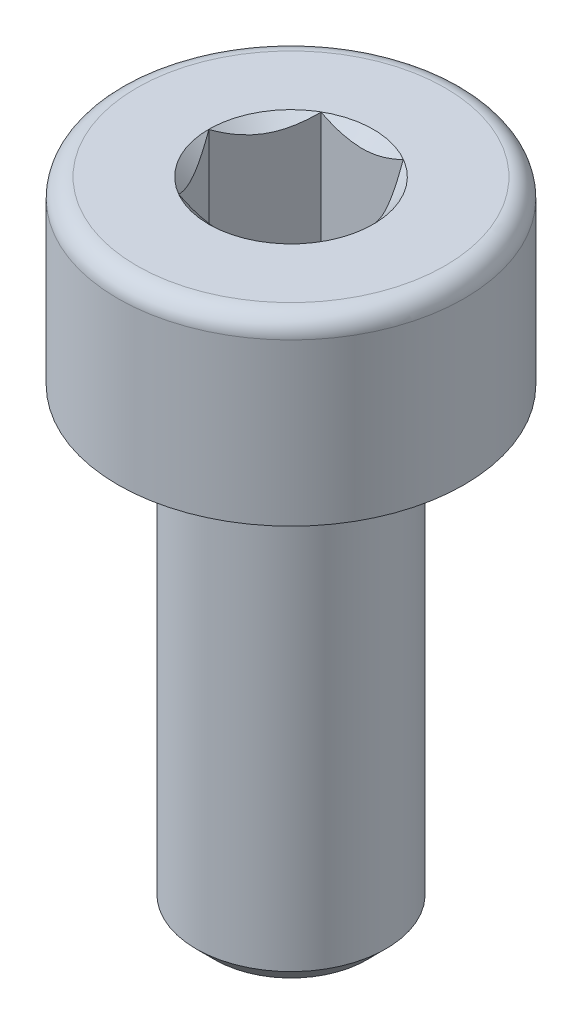
ISO-10303-21;
HEADER;
FILE_DESCRIPTION(('STEP AP214'),'2;1');
FILE_NAME('part.step','',(''),(''),'','','');
FILE_SCHEMA(('AUTOMOTIVE_DESIGN { 1 0 10303 214 1 1 1 1 }'));
ENDSEC;
DATA;
#1=APPLICATION_CONTEXT('core data for automotive mechanical design processes');
#2=APPLICATION_PROTOCOL_DEFINITION('international standard','automotive_design',2000,#1);
#3=PRODUCT_CONTEXT('',#1,'mechanical');
#4=PRODUCT('Part','Part','',(#3));
#5=PRODUCT_RELATED_PRODUCT_CATEGORY('part','',(#4));
#6=PRODUCT_DEFINITION_FORMATION('','',#4);
#7=PRODUCT_DEFINITION_CONTEXT('part definition',#1,'design');
#8=PRODUCT_DEFINITION('design','',#6,#7);
#9=PRODUCT_DEFINITION_SHAPE('','',#8);
#10=(LENGTH_UNIT() NAMED_UNIT(*) SI_UNIT(.MILLI.,.METRE.));
#11=(NAMED_UNIT(*) PLANE_ANGLE_UNIT() SI_UNIT($,.RADIAN.));
#12=(NAMED_UNIT(*) SI_UNIT($,.STERADIAN.) SOLID_ANGLE_UNIT());
#13=UNCERTAINTY_MEASURE_WITH_UNIT(LENGTH_MEASURE(1.E-05),#10,'distance_accuracy_value','');
#14=(GEOMETRIC_REPRESENTATION_CONTEXT(3) GLOBAL_UNCERTAINTY_ASSIGNED_CONTEXT((#13)) GLOBAL_UNIT_ASSIGNED_CONTEXT((#10,
#11,#12)) REPRESENTATION_CONTEXT('',''));
#15=CARTESIAN_POINT('',(0.,0.,0.));
#16=DIRECTION('',(0.,0.,1.));
#17=DIRECTION('',(1.,0.,0.));
#18=AXIS2_PLACEMENT_3D('',#15,#16,#17);
#19=CARTESIAN_POINT('',(0.,1.9,0.));
#20=DIRECTION('',(0.,1.,0.));
#21=DIRECTION('',(0.,0.,1.));
#22=AXIS2_PLACEMENT_3D('',#19,#20,#21);
#23=CONICAL_SURFACE('',#22,0.8675,0.785398163397447);
#24=CARTESIAN_POINT('',(-0.904257203356344,2.20731108686539,0.75));
#25=CARTESIAN_POINT('',(-0.882412754882664,2.19049979910954,0.75));
#26=CARTESIAN_POINT('',(-0.860451107500837,2.17384125033269,0.75));
#27=CARTESIAN_POINT('',(-0.816244486084032,2.14089387022514,0.75));
#28=CARTESIAN_POINT('',(-0.793999446840781,2.12460512647585,0.75));
#29=CARTESIAN_POINT('',(-0.72644041609512,2.07615733343807,0.75));
#30=CARTESIAN_POINT('',(-0.680633506413183,2.04467463278481,0.75));
#31=CARTESIAN_POINT('',(-0.584305204334507,1.98248336485275,0.75));
#32=CARTESIAN_POINT('',(-0.533669074640383,1.95195058649996,0.75));
#33=CARTESIAN_POINT('',(-0.42982179281195,1.89583225025063,0.75));
#34=CARTESIAN_POINT('',(-0.376620129723797,1.87022998377489,0.75));
#35=CARTESIAN_POINT('',(-0.297133733137049,1.83889962113901,0.75));
#36=CARTESIAN_POINT('',(-0.272118020151624,1.82998013178715,0.75));
#37=CARTESIAN_POINT('',(-0.221461613995012,1.81414014673559,0.75));
#38=CARTESIAN_POINT('',(-0.195820881172346,1.80721977822058,0.75));
#39=CARTESIAN_POINT('',(-0.11907719555794,1.79029491353452,0.75));
#40=CARTESIAN_POINT('',(-0.0671369524161806,1.78369713453022,0.75));
#41=CARTESIAN_POINT('',(0.0346954769499289,1.78165186600552,0.75));
#42=CARTESIAN_POINT('',(0.0845776810804192,1.78572847067954,0.75));
#43=CARTESIAN_POINT('',(0.158553806983135,1.79867277619897,0.75));
#44=CARTESIAN_POINT('',(0.183299969448746,1.80421127142444,0.75));
#45=CARTESIAN_POINT('',(0.2322573109883,1.81728731594566,0.75));
#46=CARTESIAN_POINT('',(0.256468520143736,1.82482475252543,0.75));
#47=CARTESIAN_POINT('',(0.330945548164446,1.85089644122846,0.75));
#48=CARTESIAN_POINT('',(0.380191097628158,1.87232740617748,0.75));
#49=CARTESIAN_POINT('',(0.476384677382066,1.92001795957995,0.75));
#50=CARTESIAN_POINT('',(0.523323854348435,1.94629455464135,0.75));
#51=CARTESIAN_POINT('',(0.613051165606589,2.0005514563587,0.75));
#52=CARTESIAN_POINT('',(0.655929862931857,2.02838392150654,0.75));
#53=CARTESIAN_POINT('',(0.719102713352825,2.07143006191857,0.75));
#54=CARTESIAN_POINT('',(0.739888629425195,2.08593448465665,0.75));
#55=CARTESIAN_POINT('',(0.781175323237966,2.11533224663196,0.75));
#56=CARTESIAN_POINT('',(0.801676177588827,2.13022547815469,0.75));
#57=CARTESIAN_POINT('',(0.822058112601666,2.14528009529925,0.75));
#58=B_SPLINE_CURVE_WITH_KNOTS('',3,(#24,#25,#26,#27,#28,#29,#30,#31,#32,#33,#34,#35,#36,#37,#38,
#39,#40,#41,#42,#43,#44,#45,#46,#47,#48,#49,#50,#51,#52,#53,#54,#55,#56,#57),.UNSPECIFIED.,.F.,
.F.,(4,2,2,2,2,2,2,2,2,2,2,2,2,2,2,2,4),(0.,0.0826914229952001,0.165402229814626,
0.332081999269816,0.509334939536265,0.685976204286451,0.765577633128521,0.845184125124187,
1.00113218157557,1.15024704962126,1.22624853107426,1.30224572787936,1.46290132447987,
1.62413188955185,1.7774144062988,1.85345016985303,1.92946508764176),.UNSPECIFIED.);
#59=CARTESIAN_POINT('',(0.433012701892219,1.89852540378444,0.75));
#60=VERTEX_POINT('',#59);
#61=CARTESIAN_POINT('',(-0.433012701892219,1.89852540378444,0.75));
#62=VERTEX_POINT('',#61);
#63=EDGE_CURVE('E102',#60,#62,#58,.F.);
#64=ORIENTED_EDGE('',*,*,#63,.T.);
#65=CARTESIAN_POINT('',(-0.432897231838381,1.89864089692921,0.7502));
#66=CARTESIAN_POINT('',(-0.447787073663449,1.88375951424836,0.724410037442318));
#67=CARTESIAN_POINT('',(-0.462925913388238,1.86975166939139,0.698188797871341));
#68=CARTESIAN_POINT('',(-0.493795969782309,1.8441029284667,0.644720291764294));
#69=CARTESIAN_POINT('',(-0.509530126716838,1.8324763154901,0.617467932539428));
#70=CARTESIAN_POINT('',(-0.541257419404004,1.81255944955668,0.562514649618647));
#71=CARTESIAN_POINT('',(-0.55724246221751,1.80421909786581,0.534827743304491));
#72=CARTESIAN_POINT('',(-0.589564457733289,1.79136814574586,0.478844404869148));
#73=CARTESIAN_POINT('',(-0.605900421776115,1.78684794437327,0.450549685156356));
#74=CARTESIAN_POINT('',(-0.634052006136182,1.78277123688187,0.401789710731158));
#75=CARTESIAN_POINT('',(-0.645830977225007,1.78216820039852,0.381387934344429));
#76=CARTESIAN_POINT('',(-0.66936612345897,1.78317990979996,0.340623865303642));
#77=CARTESIAN_POINT('',(-0.681122293004409,1.78479514477447,0.320261582348547));
#78=CARTESIAN_POINT('',(-0.716222952390205,1.79286155075748,0.259465456913179));
#79=CARTESIAN_POINT('',(-0.739392776123958,1.80253433961216,0.219334145003904));
#80=CARTESIAN_POINT('',(-0.780063953349298,1.82588172175675,0.148889599645977));
#81=CARTESIAN_POINT('',(-0.797755796753171,1.83833396185669,0.118246427990916));
#82=CARTESIAN_POINT('',(-0.832446334428589,1.8663850140153,0.058160654195211));
#83=CARTESIAN_POINT('',(-0.849447072771901,1.88197358968819,0.0287145116184094));
#84=CARTESIAN_POINT('',(-0.866140873838277,1.89864089692921,-0.00020000000000046));
#85=B_SPLINE_CURVE_WITH_KNOTS('',3,(#65,#66,#67,#68,#69,#70,#71,#72,#73,#74,#75,#76,#77,#78,#79,
#80,#81,#82,#83,#84),.UNSPECIFIED.,.F.,.F.,(4,2,2,2,2,2,2,2,2,4),(0.,0.0999419466095594,
0.200466857654445,0.299393763705716,0.398071297300229,0.468665775681746,0.539275821398836,
0.680536257244562,0.792918418368072,0.904939568716033),.UNSPECIFIED.);
#86=CARTESIAN_POINT('',(-0.866025403784439,1.89852540378444,0.));
#87=VERTEX_POINT('',#86);
#88=EDGE_CURVE('E11',#62,#87,#85,.T.);
#89=ORIENTED_EDGE('',*,*,#88,.T.);
#90=CARTESIAN_POINT('',(-0.866140873838277,1.89864089692921,0.000199999999999512));
#91=CARTESIAN_POINT('',(-0.851251032013209,1.88375951424836,-0.0255899625576818));
#92=CARTESIAN_POINT('',(-0.836112192288419,1.8697516693914,-0.0518112021286593));
#93=CARTESIAN_POINT('',(-0.805242135894349,1.8441029284667,-0.105279708235706));
#94=CARTESIAN_POINT('',(-0.78950797895982,1.8324763154901,-0.132532067460572));
#95=CARTESIAN_POINT('',(-0.757780686272654,1.81255944955668,-0.187485350381352));
#96=CARTESIAN_POINT('',(-0.741795643459148,1.80421909786581,-0.215172256695509));
#97=CARTESIAN_POINT('',(-0.709473647943368,1.79136814574586,-0.271155595130852));
#98=CARTESIAN_POINT('',(-0.693137683900543,1.78684794437327,-0.299450314843644));
#99=CARTESIAN_POINT('',(-0.664986099540476,1.78277123688187,-0.348210289268842));
#100=CARTESIAN_POINT('',(-0.653207128451651,1.78216820039852,-0.368612065655571));
#101=CARTESIAN_POINT('',(-0.629671982217688,1.78317990979996,-0.409376134696358));
#102=CARTESIAN_POINT('',(-0.617915812672249,1.78479514477447,-0.429738417651453));
#103=CARTESIAN_POINT('',(-0.582815153286453,1.79286155075748,-0.490534543086821));
#104=CARTESIAN_POINT('',(-0.5596453295527,1.80253433961216,-0.530665854996096));
#105=CARTESIAN_POINT('',(-0.51897415232736,1.82588172175675,-0.601110400354023));
#106=CARTESIAN_POINT('',(-0.501282308923487,1.83833396185669,-0.631753572009084));
#107=CARTESIAN_POINT('',(-0.466591771248069,1.8663850140153,-0.691839345804789));
#108=CARTESIAN_POINT('',(-0.449591032904757,1.88197358968819,-0.72128548838159));
#109=CARTESIAN_POINT('',(-0.432897231838381,1.89864089692921,-0.7502));
#110=B_SPLINE_CURVE_WITH_KNOTS('',3,(#90,#91,#92,#93,#94,#95,#96,#97,#98,#99,#100,#101,#102,
#103,#104,#105,#106,#107,#108,#109),.UNSPECIFIED.,.F.,.F.,(4,2,2,2,2,2,2,2,2,4),(0.,
0.0999419466095592,0.200466857654445,0.299393763705716,0.398071297300228,0.468665775681745,
0.539275821398836,0.680536257244562,0.792918418368072,0.904939568716032),.UNSPECIFIED.);
#111=CARTESIAN_POINT('',(-0.433012701892219,1.89852540378444,-0.75));
#112=VERTEX_POINT('',#111);
#113=EDGE_CURVE('E47',#87,#112,#110,.T.);
#114=ORIENTED_EDGE('',*,*,#113,.T.);
#115=CARTESIAN_POINT('',(-0.904257203356344,2.20731108686539,-0.75));
#116=CARTESIAN_POINT('',(-0.882412754882664,2.19049979910954,-0.75));
#117=CARTESIAN_POINT('',(-0.860451107500837,2.17384125033269,-0.75));
#118=CARTESIAN_POINT('',(-0.816244486084032,2.14089387022514,-0.75));
#119=CARTESIAN_POINT('',(-0.793999446840781,2.12460512647585,-0.75));
#120=CARTESIAN_POINT('',(-0.72644041609512,2.07615733343807,-0.75));
#121=CARTESIAN_POINT('',(-0.680633506413183,2.04467463278481,-0.75));
#122=CARTESIAN_POINT('',(-0.584305204334507,1.98248336485275,-0.75));
#123=CARTESIAN_POINT('',(-0.533669074640383,1.95195058649996,-0.75));
#124=CARTESIAN_POINT('',(-0.42982179281195,1.89583225025063,-0.75));
#125=CARTESIAN_POINT('',(-0.376620129723797,1.87022998377489,-0.75));
#126=CARTESIAN_POINT('',(-0.297133733137048,1.83889962113901,-0.75));
#127=CARTESIAN_POINT('',(-0.272118020151624,1.82998013178715,-0.75));
#128=CARTESIAN_POINT('',(-0.221461613995012,1.81414014673559,-0.75));
#129=CARTESIAN_POINT('',(-0.195820881172346,1.80721977822059,-0.75));
#130=CARTESIAN_POINT('',(-0.11907719555794,1.79029491353453,-0.75));
#131=CARTESIAN_POINT('',(-0.0671369524161802,1.78369713453023,-0.75));
#132=CARTESIAN_POINT('',(0.0346954769499295,1.78165186600552,-0.75));
#133=CARTESIAN_POINT('',(0.0845776810804198,1.78572847067954,-0.75));
#134=CARTESIAN_POINT('',(0.158553806983135,1.79867277619897,-0.75));
#135=CARTESIAN_POINT('',(0.183299969448746,1.80421127142444,-0.75));
#136=CARTESIAN_POINT('',(0.2322573109883,1.81728731594566,-0.75));
#137=CARTESIAN_POINT('',(0.256468520143736,1.82482475252543,-0.75));
#138=CARTESIAN_POINT('',(0.330945548164446,1.85089644122846,-0.75));
#139=CARTESIAN_POINT('',(0.380191097628158,1.87232740617748,-0.75));
#140=CARTESIAN_POINT('',(0.476384677382067,1.92001795957995,-0.75));
#141=CARTESIAN_POINT('',(0.523323854348436,1.94629455464135,-0.75));
#142=CARTESIAN_POINT('',(0.61305116560659,2.0005514563587,-0.75));
#143=CARTESIAN_POINT('',(0.655929862931858,2.02838392150654,-0.75));
#144=CARTESIAN_POINT('',(0.719102713352826,2.07143006191857,-0.75));
#145=CARTESIAN_POINT('',(0.739888629425196,2.08593448465665,-0.75));
#146=CARTESIAN_POINT('',(0.781175323237966,2.11533224663196,-0.75));
#147=CARTESIAN_POINT('',(0.801676177588828,2.13022547815469,-0.75));
#148=CARTESIAN_POINT('',(0.822058112601667,2.14528009529925,-0.75));
#149=B_SPLINE_CURVE_WITH_KNOTS('',3,(#115,#116,#117,#118,#119,#120,#121,#122,#123,#124,#125,
#126,#127,#128,#129,#130,#131,#132,#133,#134,#135,#136,#137,#138,#139,#140,#141,#142,#143,#144,
#145,#146,#147,#148),.UNSPECIFIED.,.F.,.F.,(4,2,2,2,2,2,2,2,2,2,2,2,2,2,2,2,4),(0.,
0.0826914229952003,0.165402229814626,0.332081999269817,0.509334939536265,0.685976204286452,
0.765577633128521,0.845184125124188,1.00113218157557,1.15024704962126,1.22624853107426,
1.30224572787936,1.46290132447987,1.62413188955185,1.7774144062988,1.85345016985303,
1.92946508764176),.UNSPECIFIED.);
#150=CARTESIAN_POINT('',(0.433012701892219,1.89852540378444,-0.75));
#151=VERTEX_POINT('',#150);
#152=EDGE_CURVE('E226',#112,#151,#149,.T.);
#153=ORIENTED_EDGE('',*,*,#152,.T.);
#154=CARTESIAN_POINT('',(0.432897231838381,1.89864089692921,-0.7502));
#155=CARTESIAN_POINT('',(0.447787073663449,1.88375951424836,-0.724410037442319));
#156=CARTESIAN_POINT('',(0.462925913388238,1.8697516693914,-0.698188797871341));
#157=CARTESIAN_POINT('',(0.493795969782309,1.8441029284667,-0.644720291764295));
#158=CARTESIAN_POINT('',(0.509530126716838,1.8324763154901,-0.617467932539429));
#159=CARTESIAN_POINT('',(0.541257419404004,1.81255944955668,-0.562514649618648));
#160=CARTESIAN_POINT('',(0.55724246221751,1.80421909786581,-0.534827743304492));
#161=CARTESIAN_POINT('',(0.589564457733289,1.79136814574586,-0.478844404869149));
#162=CARTESIAN_POINT('',(0.605900421776115,1.78684794437327,-0.450549685156357));
#163=CARTESIAN_POINT('',(0.634052006136182,1.78277123688187,-0.401789710731159));
#164=CARTESIAN_POINT('',(0.645830977225007,1.78216820039852,-0.38138793434443));
#165=CARTESIAN_POINT('',(0.66936612345897,1.78317990979996,-0.340623865303643));
#166=CARTESIAN_POINT('',(0.681122293004409,1.78479514477447,-0.320261582348548));
#167=CARTESIAN_POINT('',(0.716222952390205,1.79286155075748,-0.25946545691318));
#168=CARTESIAN_POINT('',(0.739392776123958,1.80253433961216,-0.219334145003905));
#169=CARTESIAN_POINT('',(0.780063953349298,1.82588172175675,-0.148889599645978));
#170=CARTESIAN_POINT('',(0.797755796753172,1.83833396185669,-0.118246427990917));
#171=CARTESIAN_POINT('',(0.832446334428589,1.8663850140153,-0.058160654195212));
#172=CARTESIAN_POINT('',(0.849447072771901,1.88197358968819,-0.0287145116184103));
#173=CARTESIAN_POINT('',(0.866140873838277,1.89864089692921,0.000199999999999458));
#174=B_SPLINE_CURVE_WITH_KNOTS('',3,(#154,#155,#156,#157,#158,#159,#160,#161,#162,#163,#164,
#165,#166,#167,#168,#169,#170,#171,#172,#173),.UNSPECIFIED.,.F.,.F.,(4,2,2,2,2,2,2,2,2,4),(0.,
0.0999419466095591,0.200466857654445,0.299393763705716,0.398071297300228,0.468665775681745,
0.539275821398836,0.680536257244562,0.792918418368072,0.904939568716032),.UNSPECIFIED.);
#175=CARTESIAN_POINT('',(0.866025403784439,1.89852540378444,0.));
#176=VERTEX_POINT('',#175);
#177=EDGE_CURVE('E220',#151,#176,#174,.T.);
#178=ORIENTED_EDGE('',*,*,#177,.T.);
#179=CARTESIAN_POINT('',(0.866140873838277,1.89864089692921,-0.000200000000000392));
#180=CARTESIAN_POINT('',(0.851251032013209,1.88375951424836,0.025589962557681));
#181=CARTESIAN_POINT('',(0.836112192288419,1.86975166939139,0.0518112021286586));
#182=CARTESIAN_POINT('',(0.805242135894349,1.8441029284667,0.105279708235706));
#183=CARTESIAN_POINT('',(0.78950797895982,1.8324763154901,0.132532067460572));
#184=CARTESIAN_POINT('',(0.757780686272654,1.81255944955668,0.187485350381352));
#185=CARTESIAN_POINT('',(0.741795643459148,1.80421909786581,0.215172256695508));
#186=CARTESIAN_POINT('',(0.709473647943368,1.79136814574586,0.271155595130852));
#187=CARTESIAN_POINT('',(0.693137683900543,1.78684794437327,0.299450314843643));
#188=CARTESIAN_POINT('',(0.664986099540475,1.78277123688187,0.348210289268842));
#189=CARTESIAN_POINT('',(0.653207128451651,1.78216820039852,0.368612065655571));
#190=CARTESIAN_POINT('',(0.629671982217688,1.78317990979996,0.409376134696358));
#191=CARTESIAN_POINT('',(0.617915812672248,1.78479514477447,0.429738417651453));
#192=CARTESIAN_POINT('',(0.582815153286452,1.79286155075748,0.490534543086821));
#193=CARTESIAN_POINT('',(0.5596453295527,1.80253433961216,0.530665854996096));
#194=CARTESIAN_POINT('',(0.51897415232736,1.82588172175675,0.601110400354023));
#195=CARTESIAN_POINT('',(0.501282308923486,1.83833396185669,0.631753572009084));
#196=CARTESIAN_POINT('',(0.466591771248069,1.8663850140153,0.691839345804788));
#197=CARTESIAN_POINT('',(0.449591032904757,1.88197358968819,0.72128548838159));
#198=CARTESIAN_POINT('',(0.432897231838381,1.89864089692921,0.7502));
#199=B_SPLINE_CURVE_WITH_KNOTS('',3,(#179,#180,#181,#182,#183,#184,#185,#186,#187,#188,#189,
#190,#191,#192,#193,#194,#195,#196,#197,#198),.UNSPECIFIED.,.F.,.F.,(4,2,2,2,2,2,2,2,2,4),(0.,
0.0999419466095594,0.200466857654446,0.299393763705716,0.398071297300229,0.468665775681746,
0.539275821398837,0.680536257244563,0.792918418368072,0.904939568716032),.UNSPECIFIED.);
#200=EDGE_CURVE('E202',#176,#60,#199,.T.);
#201=ORIENTED_EDGE('',*,*,#200,.T.);
#202=EDGE_LOOP('',(#64,#89,#114,#153,#178,#201));
#203=FACE_BOUND('',#202,.T.);
#204=CARTESIAN_POINT('',(0.,1.9,0.));
#205=DIRECTION('',(0.,1.,0.));
#206=DIRECTION('',(0.,0.,1.));
#207=AXIS2_PLACEMENT_3D('',#204,#205,#206);
#208=CIRCLE('',#207,0.8675);
#209=CARTESIAN_POINT('',(0.,1.9,0.8675));
#210=VERTEX_POINT('',#209);
#211=EDGE_CURVE('E194',#210,#210,#208,.T.);
#212=ORIENTED_EDGE('',*,*,#211,.T.);
#213=EDGE_LOOP('',(#212));
#214=FACE_BOUND('',#213,.T.);
#215=ADVANCED_FACE('F35',(#203,#214),#23,.F.);
#216=CARTESIAN_POINT('',(0.,1.9,-1.625));
#217=DIRECTION('',(0.,-1.,0.));
#218=DIRECTION('',(0.,0.,-1.));
#219=AXIS2_PLACEMENT_3D('',#216,#217,#218);
#220=PLANE('',#219);
#221=ORIENTED_EDGE('',*,*,#211,.F.);
#222=EDGE_LOOP('',(#221));
#223=FACE_BOUND('',#222,.T.);
#224=CARTESIAN_POINT('',(0.,1.9,0.));
#225=DIRECTION('',(0.,1.,0.));
#226=DIRECTION('',(0.,0.,1.));
#227=AXIS2_PLACEMENT_3D('',#224,#225,#226);
#228=CIRCLE('',#227,1.625);
#229=CARTESIAN_POINT('',(0.,1.9,1.625));
#230=VERTEX_POINT('',#229);
#231=EDGE_CURVE('E191',#230,#230,#228,.T.);
#232=ORIENTED_EDGE('',*,*,#231,.T.);
#233=EDGE_LOOP('',(#232));
#234=FACE_BOUND('',#233,.T.);
#235=ADVANCED_FACE('F212',(#223,#234),#220,.F.);
#236=CARTESIAN_POINT('',(0.,1.7,0.));
#237=DIRECTION('',(0.,1.,0.));
#238=DIRECTION('',(0.,0.,1.));
#239=AXIS2_PLACEMENT_3D('',#236,#237,#238);
#240=TOROIDAL_SURFACE('',#239,1.625,0.2);
#241=ORIENTED_EDGE('',*,*,#231,.F.);
#242=EDGE_LOOP('',(#241));
#243=FACE_BOUND('',#242,.T.);
#244=CARTESIAN_POINT('',(0.,1.7,0.));
#245=DIRECTION('',(0.,1.,0.));
#246=DIRECTION('',(0.,0.,1.));
#247=AXIS2_PLACEMENT_3D('',#244,#245,#246);
#248=CIRCLE('',#247,1.825);
#249=CARTESIAN_POINT('',(0.,1.7,1.825));
#250=VERTEX_POINT('',#249);
#251=EDGE_CURVE('E188',#250,#250,#248,.T.);
#252=ORIENTED_EDGE('',*,*,#251,.T.);
#253=EDGE_LOOP('',(#252));
#254=FACE_BOUND('',#253,.T.);
#255=ADVANCED_FACE('F287',(#243,#254),#240,.T.);
#256=CARTESIAN_POINT('',(0.,2.83766527063465,0.));
#257=DIRECTION('',(0.,1.,0.));
#258=DIRECTION('',(0.,0.,1.));
#259=AXIS2_PLACEMENT_3D('',#256,#257,#258);
#260=CYLINDRICAL_SURFACE('',#259,1.825);
#261=ORIENTED_EDGE('',*,*,#251,.F.);
#262=EDGE_LOOP('',(#261));
#263=FACE_BOUND('',#262,.T.);
#264=CARTESIAN_POINT('',(0.,0.,0.));
#265=DIRECTION('',(0.,1.,0.));
#266=DIRECTION('',(0.,0.,1.));
#267=AXIS2_PLACEMENT_3D('',#264,#265,#266);
#268=CIRCLE('',#267,1.825);
#269=CARTESIAN_POINT('',(0.,0.,1.825));
#270=VERTEX_POINT('',#269);
#271=EDGE_CURVE('E185',#270,#270,#268,.T.);
#272=ORIENTED_EDGE('',*,*,#271,.T.);
#273=EDGE_LOOP('',(#272));
#274=FACE_BOUND('',#273,.T.);
#275=ADVANCED_FACE('F284',(#263,#274),#260,.T.);
#276=CARTESIAN_POINT('',(0.,0.,-1.2));
#277=DIRECTION('',(0.,1.,0.));
#278=DIRECTION('',(0.,0.,1.));
#279=AXIS2_PLACEMENT_3D('',#276,#277,#278);
#280=PLANE('',#279);
#281=ORIENTED_EDGE('',*,*,#271,.F.);
#282=EDGE_LOOP('',(#281));
#283=FACE_BOUND('',#282,.T.);
#284=CARTESIAN_POINT('',(0.,0.,0.));
#285=DIRECTION('',(0.,1.,0.));
#286=DIRECTION('',(0.,0.,1.));
#287=AXIS2_PLACEMENT_3D('',#284,#285,#286);
#288=CIRCLE('',#287,1.2);
#289=CARTESIAN_POINT('',(0.,0.,1.2));
#290=VERTEX_POINT('',#289);
#291=EDGE_CURVE('E182',#290,#290,#288,.T.);
#292=ORIENTED_EDGE('',*,*,#291,.T.);
#293=EDGE_LOOP('',(#292));
#294=FACE_BOUND('',#293,.T.);
#295=ADVANCED_FACE('F280',(#283,#294),#280,.F.);
#296=CARTESIAN_POINT('',(0.,-0.2,0.));
#297=DIRECTION('',(0.,1.,0.));
#298=DIRECTION('',(0.,0.,1.));
#299=AXIS2_PLACEMENT_3D('',#296,#297,#298);
#300=TOROIDAL_SURFACE('',#299,1.2,0.2);
#301=ORIENTED_EDGE('',*,*,#291,.F.);
#302=EDGE_LOOP('',(#301));
#303=FACE_BOUND('',#302,.T.);
#304=CARTESIAN_POINT('',(0.,-0.2,0.));
#305=DIRECTION('',(0.,1.,0.));
#306=DIRECTION('',(0.,0.,1.));
#307=AXIS2_PLACEMENT_3D('',#304,#305,#306);
#308=CIRCLE('',#307,1.);
#309=CARTESIAN_POINT('',(0.,-0.2,1.));
#310=VERTEX_POINT('',#309);
#311=EDGE_CURVE('E179',#310,#310,#308,.T.);
#312=ORIENTED_EDGE('',*,*,#311,.T.);
#313=EDGE_LOOP('',(#312));
#314=FACE_BOUND('',#313,.T.);
#315=ADVANCED_FACE('F276',(#303,#314),#300,.F.);
#316=CARTESIAN_POINT('',(0.,2.83766527063465,0.));
#317=DIRECTION('',(0.,1.,0.));
#318=DIRECTION('',(0.,0.,1.));
#319=AXIS2_PLACEMENT_3D('',#316,#317,#318);
#320=CYLINDRICAL_SURFACE('',#319,1.);
#321=ORIENTED_EDGE('',*,*,#311,.F.);
#322=EDGE_LOOP('',(#321));
#323=FACE_BOUND('',#322,.T.);
#324=CARTESIAN_POINT('',(0.,-4.65,0.));
#325=DIRECTION('',(0.,1.,0.));
#326=DIRECTION('',(0.,0.,1.));
#327=AXIS2_PLACEMENT_3D('',#324,#325,#326);
#328=CIRCLE('',#327,1.);
#329=CARTESIAN_POINT('',(0.,-4.65,1.));
#330=VERTEX_POINT('',#329);
#331=EDGE_CURVE('E176',#330,#330,#328,.T.);
#332=ORIENTED_EDGE('',*,*,#331,.T.);
#333=EDGE_LOOP('',(#332));
#334=FACE_BOUND('',#333,.T.);
#335=ADVANCED_FACE('F272',(#323,#334),#320,.T.);
#336=CARTESIAN_POINT('',(0.,-4.85,0.));
#337=DIRECTION('',(0.,1.,0.));
#338=DIRECTION('',(0.,0.,1.));
#339=AXIS2_PLACEMENT_3D('',#336,#337,#338);
#340=CONICAL_SURFACE('',#339,0.800000000000001,0.785398163397449);
#341=ORIENTED_EDGE('',*,*,#331,.F.);
#342=EDGE_LOOP('',(#341));
#343=FACE_BOUND('',#342,.T.);
#344=CARTESIAN_POINT('',(0.,-4.85,0.));
#345=DIRECTION('',(0.,1.,0.));
#346=DIRECTION('',(0.,0.,1.));
#347=AXIS2_PLACEMENT_3D('',#344,#345,#346);
#348=CIRCLE('',#347,0.800000000000001);
#349=CARTESIAN_POINT('',(0.,-4.85,0.800000000000001));
#350=VERTEX_POINT('',#349);
#351=EDGE_CURVE('E173',#350,#350,#348,.T.);
#352=ORIENTED_EDGE('',*,*,#351,.T.);
#353=EDGE_LOOP('',(#352));
#354=FACE_BOUND('',#353,.T.);
#355=ADVANCED_FACE('F265',(#343,#354),#340,.T.);
#356=CARTESIAN_POINT('',(0.,-4.85,0.));
#357=DIRECTION('',(0.,1.,0.));
#358=DIRECTION('',(0.,0.,1.));
#359=AXIS2_PLACEMENT_3D('',#356,#357,#358);
#360=PLANE('',#359);
#361=ORIENTED_EDGE('',*,*,#351,.F.);
#362=EDGE_LOOP('',(#361));
#363=FACE_BOUND('',#362,.T.);
#364=ADVANCED_FACE('F261',(#363),#360,.F.);
#365=CARTESIAN_POINT('',(-0.649519052838329,0.8,0.375));
#366=DIRECTION('',(-0.866025403784438,0.,0.5));
#367=DIRECTION('',(0.5,0.,0.866025403784439));
#368=AXIS2_PLACEMENT_3D('',#365,#366,#367);
#369=PLANE('',#368);
#370=ORIENTED_EDGE('',*,*,#88,.F.);
#371=DIRECTION('',(0.,1.,0.));
#372=VECTOR('',#371,1.);
#373=CARTESIAN_POINT('',(-0.433012701892219,0.8,0.75));
#374=LINE('',#373,#372);
#375=CARTESIAN_POINT('',(-0.433012701891886,0.699148641473365,0.750000000000577));
#376=VERTEX_POINT('',#375);
#377=EDGE_CURVE('E54',#376,#62,#374,.T.);
#378=ORIENTED_EDGE('',*,*,#377,.F.);
#379=CARTESIAN_POINT('',(-0.866140873838277,0.699215321476222,-0.000200000000000537));
#380=CARTESIAN_POINT('',(-0.847110639113084,0.688220674223406,0.0327613334239951));
#381=CARTESIAN_POINT('',(-0.82791613989027,0.678220782647563,0.0660071813037496));
#382=CARTESIAN_POINT('',(-0.789194642655935,0.660764353404076,0.133074781858755));
#383=CARTESIAN_POINT('',(-0.769666955685214,0.653313993806985,0.166897727846345));
#384=CARTESIAN_POINT('',(-0.730853637225087,0.641714345217257,0.234124367429636));
#385=CARTESIAN_POINT('',(-0.71157398392345,0.637487889682862,0.267517706500385));
#386=CARTESIAN_POINT('',(-0.672923778458478,0.632438787424669,0.334461826088693));
#387=CARTESIAN_POINT('',(-0.653553367146577,0.631611963412167,0.368012362644412));
#388=CARTESIAN_POINT('',(-0.617346612643384,0.633315409517752,0.430724301021116));
#389=CARTESIAN_POINT('',(-0.600504899317171,0.635427420851539,0.459895004188625));
#390=CARTESIAN_POINT('',(-0.566931216773448,0.642126429282162,0.518046328151542));
#391=CARTESIAN_POINT('',(-0.550199364021242,0.646715723431468,0.547026747223125));
#392=CARTESIAN_POINT('',(-0.516556238850178,0.658190638358433,0.605298349344807));
#393=CARTESIAN_POINT('',(-0.499649233036119,0.665124989147788,0.634582142418619));
#394=CARTESIAN_POINT('',(-0.466087649424642,0.680864019072363,0.692712510416168));
#395=CARTESIAN_POINT('',(-0.449432640341858,0.689664990664254,0.721559832348071));
#396=CARTESIAN_POINT('',(-0.432897231838381,0.699215321476222,0.7502));
#397=B_SPLINE_CURVE_WITH_KNOTS('',3,(#379,#380,#381,#382,#383,#384,#385,#386,#387,#388,#389,
#390,#391,#392,#393,#394,#395,#396),.UNSPECIFIED.,.F.,.F.,(4,2,2,2,2,2,2,2,4),(0.,
0.118896819359341,0.238079744533805,0.354311719456401,0.470400831872515,0.571553114284105,
0.672799351342655,0.776293900714049,0.87958477934405),.UNSPECIFIED.);
#398=CARTESIAN_POINT('',(-0.866025403784772,0.699148641473366,5.76386946737661E-13));
#399=VERTEX_POINT('',#398);
#400=EDGE_CURVE('E114',#399,#376,#397,.T.);
#401=ORIENTED_EDGE('',*,*,#400,.F.);
#402=DIRECTION('',(0.,1.,0.));
#403=VECTOR('',#402,1.);
#404=CARTESIAN_POINT('',(-0.866025403784439,0.8,0.));
#405=LINE('',#404,#403);
#406=EDGE_CURVE('E62',#399,#87,#405,.T.);
#407=ORIENTED_EDGE('',*,*,#406,.T.);
#408=EDGE_LOOP('',(#370,#378,#401,#407));
#409=FACE_BOUND('',#408,.T.);
#410=ADVANCED_FACE('F239',(#409),#369,.F.);
#411=CARTESIAN_POINT('',(-0.649519052838329,0.8,-0.375));
#412=DIRECTION('',(-0.866025403784438,0.,-0.5));
#413=DIRECTION('',(-0.5,0.,0.866025403784439));
#414=AXIS2_PLACEMENT_3D('',#411,#412,#413);
#415=PLANE('',#414);
#416=ORIENTED_EDGE('',*,*,#113,.F.);
#417=ORIENTED_EDGE('',*,*,#406,.F.);
#418=CARTESIAN_POINT('',(-0.432897231838381,0.699215321476222,-0.7502));
#419=CARTESIAN_POINT('',(-0.451927466563574,0.688220674223406,-0.717238666576005));
#420=CARTESIAN_POINT('',(-0.471121965786388,0.678220782647563,-0.68399281869625));
#421=CARTESIAN_POINT('',(-0.509843463020723,0.660764353404076,-0.616925218141245));
#422=CARTESIAN_POINT('',(-0.529371149991444,0.653313993806985,-0.583102272153655));
#423=CARTESIAN_POINT('',(-0.568184468451571,0.641714345217258,-0.515875632570364));
#424=CARTESIAN_POINT('',(-0.587464121753208,0.637487889682863,-0.482482293499614));
#425=CARTESIAN_POINT('',(-0.62611432721818,0.63243878742467,-0.415538173911307));
#426=CARTESIAN_POINT('',(-0.645484738530081,0.631611963412168,-0.381987637355588));
#427=CARTESIAN_POINT('',(-0.681691493033274,0.633315409517752,-0.319275698978884));
#428=CARTESIAN_POINT('',(-0.698533206359486,0.63542742085154,-0.290104995811375));
#429=CARTESIAN_POINT('',(-0.732106888903209,0.642126429282163,-0.231953671848458));
#430=CARTESIAN_POINT('',(-0.748838741655416,0.646715723431468,-0.202973252776875));
#431=CARTESIAN_POINT('',(-0.78248186682648,0.658190638358434,-0.144701650655193));
#432=CARTESIAN_POINT('',(-0.799388872640539,0.665124989147789,-0.115417857581381));
#433=CARTESIAN_POINT('',(-0.832950456252016,0.680864019072363,-0.0572874895838322));
#434=CARTESIAN_POINT('',(-0.8496054653348,0.689664990664254,-0.0284401676519291));
#435=CARTESIAN_POINT('',(-0.866140873838277,0.699215321476222,0.000199999999999481));
#436=B_SPLINE_CURVE_WITH_KNOTS('',3,(#418,#419,#420,#421,#422,#423,#424,#425,#426,#427,#428,
#429,#430,#431,#432,#433,#434,#435),.UNSPECIFIED.,.F.,.F.,(4,2,2,2,2,2,2,2,4),(0.,
0.118896819359341,0.238079744533805,0.354311719456401,0.470400831872515,0.571553114284105,
0.672799351342655,0.776293900714049,0.87958477934405),.UNSPECIFIED.);
#437=CARTESIAN_POINT('',(-0.43301270189222,0.699148641477997,-0.75));
#438=VERTEX_POINT('',#437);
#439=EDGE_CURVE('E155',#438,#399,#436,.T.);
#440=ORIENTED_EDGE('',*,*,#439,.F.);
#441=DIRECTION('',(0.,1.,0.));
#442=VECTOR('',#441,1.);
#443=CARTESIAN_POINT('',(-0.433012701892219,0.8,-0.75));
#444=LINE('',#443,#442);
#445=EDGE_CURVE('E240',#438,#112,#444,.T.);
#446=ORIENTED_EDGE('',*,*,#445,.T.);
#447=EDGE_LOOP('',(#416,#417,#440,#446));
#448=FACE_BOUND('',#447,.T.);
#449=ADVANCED_FACE('F139',(#448),#415,.F.);
#450=CARTESIAN_POINT('',(0.,0.8,-0.75));
#451=DIRECTION('',(0.,0.,-1.));
#452=DIRECTION('',(-1.,0.,0.));
#453=AXIS2_PLACEMENT_3D('',#450,#451,#452);
#454=PLANE('',#453);
#455=ORIENTED_EDGE('',*,*,#152,.F.);
#456=ORIENTED_EDGE('',*,*,#445,.F.);
#457=CARTESIAN_POINT('',(-1.14392924171127,0.988889972556753,-0.750000000000001));
#458=CARTESIAN_POINT('',(-1.11129928011968,0.973138090869845,-0.750000000000001));
#459=CARTESIAN_POINT('',(-1.07859265503181,0.957545743427019,-0.750000000000001));
#460=CARTESIAN_POINT('',(-1.012984149522,0.926763375327337,-0.750000000000001));
#461=CARTESIAN_POINT('',(-0.980082237318409,0.911573422484459,-0.750000000000001));
#462=CARTESIAN_POINT('',(-0.88066267507201,0.866570463757842,-0.750000000000001));
#463=CARTESIAN_POINT('',(-0.81380045948897,0.837505001643094,-0.75));
#464=CARTESIAN_POINT('',(-0.676891071509725,0.781742542375791,-0.75));
#465=CARTESIAN_POINT('',(-0.606807141507163,0.755134658188647,-0.75));
#466=CARTESIAN_POINT('',(-0.46484559913824,0.707499590873555,-0.75));
#467=CARTESIAN_POINT('',(-0.392972860708597,0.686458745099361,-0.75));
#468=CARTESIAN_POINT('',(-0.283762301486207,0.661719184110614,-0.75));
#469=CARTESIAN_POINT('',(-0.247205008136231,0.654617583350701,-0.75));
#470=CARTESIAN_POINT('',(-0.173656205225225,0.643146979032118,-0.75));
#471=CARTESIAN_POINT('',(-0.136664738331818,0.638777709211616,-0.75));
#472=CARTESIAN_POINT('',(-0.0629045494364837,0.633176185039324,-0.75));
#473=CARTESIAN_POINT('',(-0.02613884151586,0.631905321123122,-0.75));
#474=CARTESIAN_POINT('',(0.0473669674614357,0.632504085636384,-0.75));
#475=CARTESIAN_POINT('',(0.0841070664259308,0.634373946058491,-0.75));
#476=CARTESIAN_POINT('',(0.173345015364301,0.642565343932932,-0.75));
#477=CARTESIAN_POINT('',(0.225697450576709,0.650477813191898,-0.75));
#478=CARTESIAN_POINT('',(0.329421021547351,0.671247227700126,-0.75));
#479=CARTESIAN_POINT('',(0.380790948181767,0.684109899551848,-0.75));
#480=CARTESIAN_POINT('',(0.483729694328043,0.713753062882601,-0.75));
#481=CARTESIAN_POINT('',(0.535272413043993,0.730622016756376,-0.75));
#482=CARTESIAN_POINT('',(0.611869547821967,0.757862349549278,-0.75));
#483=CARTESIAN_POINT('',(0.637278832990042,0.767263786282497,-0.75));
#484=CARTESIAN_POINT('',(0.687893903774538,0.786611675487553,-0.75));
#485=CARTESIAN_POINT('',(0.713099658867192,0.796558208028436,-0.75));
#486=CARTESIAN_POINT('',(0.797346245898725,0.83067471888575,-0.75));
#487=CARTESIAN_POINT('',(0.855974220880225,0.855862404697281,-0.75));
#488=CARTESIAN_POINT('',(0.972500365064712,0.907879776895605,-0.75));
#489=CARTESIAN_POINT('',(1.03039838428627,0.934709794303458,-0.75));
#490=CARTESIAN_POINT('',(1.14568483442828,0.9895121454834,-0.75));
#491=CARTESIAN_POINT('',(1.20307299547003,1.01748504490513,-0.75));
#492=CARTESIAN_POINT('',(1.31745118876516,1.07423502082449,-0.75));
#493=CARTESIAN_POINT('',(1.37444120581081,1.10301212783243,-0.75));
#494=CARTESIAN_POINT('',(1.54520955042651,1.19033369355946,-0.75));
#495=CARTESIAN_POINT('',(1.65854144440532,1.24974947544961,-0.75));
#496=CARTESIAN_POINT('',(1.88446377235471,1.3698751839927,-0.75));
#497=CARTESIAN_POINT('',(1.99705443810476,1.43058467822829,-0.75));
#498=CARTESIAN_POINT('',(2.20562560728674,1.54404647664553,-0.75));
#499=CARTESIAN_POINT('',(2.30166658321441,1.59668772574537,-0.75));
#500=CARTESIAN_POINT('',(2.49352154930147,1.70240423146011,-0.75));
#501=CARTESIAN_POINT('',(2.58933551579986,1.75547953095283,-0.75));
#502=CARTESIAN_POINT('',(2.78041816930175,1.86173344145093,-0.75));
#503=CARTESIAN_POINT('',(2.87568752730211,1.91491084672778,-0.75));
#504=CARTESIAN_POINT('',(3.06608386909457,2.02149550384075,-0.75));
#505=CARTESIAN_POINT('',(3.16121086738527,2.0749027297698,-0.75));
#506=CARTESIAN_POINT('',(3.25629167728812,2.12839162665602,-0.75));
#507=B_SPLINE_CURVE_WITH_KNOTS('',3,(#457,#458,#459,#460,#461,#462,#463,#464,#465,#466,#467,
#468,#469,#470,#471,#472,#473,#474,#475,#476,#477,#478,#479,#480,#481,#482,#483,#484,#485,#486,
#487,#488,#489,#490,#491,#492,#493,#494,#495,#496,#497,#498,#499,#500,#501,#502,#503,#504,#505,
#506),.UNSPECIFIED.,.F.,.F.,(4,2,2,2,2,2,2,2,2,2,2,2,2,2,2,2,2,2,2,2,2,2,2,2,4),(0.,
0.108697578912757,0.217413361143597,0.4360778158952,0.660865347278843,0.885095976681721,
0.996734001704509,1.10836114606183,1.21859001746764,1.32882703139378,1.48734075732974,
1.64603841251773,1.80863365439765,1.88990790289077,1.97119412191388,2.16257832306687,
2.35400122660177,2.54552004734117,2.7370461438776,3.12091442439534,3.50465635106728,
3.83321936376042,4.16181523545699,4.48913241989211,4.81641362588254),.UNSPECIFIED.);
#508=CARTESIAN_POINT('',(0.433012701891886,0.699148641473366,-0.750000000000577));
#509=VERTEX_POINT('',#508);
#510=EDGE_CURVE('E119',#509,#438,#507,.F.);
#511=ORIENTED_EDGE('',*,*,#510,.F.);
#512=DIRECTION('',(0.,1.,0.));
#513=VECTOR('',#512,1.);
#514=CARTESIAN_POINT('',(0.433012701892219,0.8,-0.75));
#515=LINE('',#514,#513);
#516=EDGE_CURVE('E242',#509,#151,#515,.T.);
#517=ORIENTED_EDGE('',*,*,#516,.T.);
#518=EDGE_LOOP('',(#455,#456,#511,#517));
#519=FACE_BOUND('',#518,.T.);
#520=ADVANCED_FACE('F243',(#519),#454,.F.);
#521=CARTESIAN_POINT('',(0.649519052838329,0.8,-0.375));
#522=DIRECTION('',(0.866025403784438,0.,-0.5));
#523=DIRECTION('',(-0.5,0.,-0.866025403784438));
#524=AXIS2_PLACEMENT_3D('',#521,#522,#523);
#525=PLANE('',#524);
#526=ORIENTED_EDGE('',*,*,#177,.F.);
#527=ORIENTED_EDGE('',*,*,#516,.F.);
#528=CARTESIAN_POINT('',(0.866140873838277,0.699215321476222,0.000199999999999607));
#529=CARTESIAN_POINT('',(0.847110639113084,0.688220674223406,-0.032761333423996));
#530=CARTESIAN_POINT('',(0.82791613989027,0.678220782647563,-0.0660071813037505));
#531=CARTESIAN_POINT('',(0.789194642655935,0.660764353404076,-0.133074781858756));
#532=CARTESIAN_POINT('',(0.769666955685214,0.653313993806985,-0.166897727846346));
#533=CARTESIAN_POINT('',(0.730853637225087,0.641714345217258,-0.234124367429637));
#534=CARTESIAN_POINT('',(0.71157398392345,0.637487889682862,-0.267517706500386));
#535=CARTESIAN_POINT('',(0.672923778458477,0.632438787424669,-0.334461826088694));
#536=CARTESIAN_POINT('',(0.653553367146577,0.631611963412168,-0.368012362644413));
#537=CARTESIAN_POINT('',(0.617346612643383,0.633315409517752,-0.430724301021117));
#538=CARTESIAN_POINT('',(0.600504899317171,0.635427420851539,-0.459895004188626));
#539=CARTESIAN_POINT('',(0.566931216773448,0.642126429282163,-0.518046328151542));
#540=CARTESIAN_POINT('',(0.550199364021242,0.646715723431468,-0.547026747223125));
#541=CARTESIAN_POINT('',(0.516556238850178,0.658190638358434,-0.605298349344807));
#542=CARTESIAN_POINT('',(0.499649233036119,0.665124989147789,-0.63458214241862));
#543=CARTESIAN_POINT('',(0.466087649424642,0.680864019072363,-0.692712510416168));
#544=CARTESIAN_POINT('',(0.449432640341858,0.689664990664254,-0.721559832348072));
#545=CARTESIAN_POINT('',(0.432897231838381,0.699215321476222,-0.7502));
#546=B_SPLINE_CURVE_WITH_KNOTS('',3,(#528,#529,#530,#531,#532,#533,#534,#535,#536,#537,#538,
#539,#540,#541,#542,#543,#544,#545),.UNSPECIFIED.,.F.,.F.,(4,2,2,2,2,2,2,2,4),(0.,
0.118896819359341,0.238079744533805,0.354311719456401,0.470400831872515,0.571553114284105,
0.672799351342655,0.776293900714049,0.87958477934405),.UNSPECIFIED.);
#547=CARTESIAN_POINT('',(0.866025403784772,0.699148641473366,-5.77290917835199E-13));
#548=VERTEX_POINT('',#547);
#549=EDGE_CURVE('E117',#548,#509,#546,.T.);
#550=ORIENTED_EDGE('',*,*,#549,.F.);
#551=DIRECTION('',(0.,1.,0.));
#552=VECTOR('',#551,1.);
#553=CARTESIAN_POINT('',(0.866025403784439,0.8,0.));
#554=LINE('',#553,#552);
#555=EDGE_CURVE('E107',#548,#176,#554,.T.);
#556=ORIENTED_EDGE('',*,*,#555,.T.);
#557=EDGE_LOOP('',(#526,#527,#550,#556));
#558=FACE_BOUND('',#557,.T.);
#559=ADVANCED_FACE('F246',(#558),#525,.F.);
#560=CARTESIAN_POINT('',(0.649519052838329,0.8,0.375));
#561=DIRECTION('',(0.866025403784438,0.,0.5));
#562=DIRECTION('',(0.5,0.,-0.866025403784439));
#563=AXIS2_PLACEMENT_3D('',#560,#561,#562);
#564=PLANE('',#563);
#565=ORIENTED_EDGE('',*,*,#200,.F.);
#566=ORIENTED_EDGE('',*,*,#555,.F.);
#567=CARTESIAN_POINT('',(0.432897231838381,0.699215321476222,0.7502));
#568=CARTESIAN_POINT('',(0.451927466563574,0.688220674223405,0.717238666576004));
#569=CARTESIAN_POINT('',(0.471121965786388,0.678220782647563,0.68399281869625));
#570=CARTESIAN_POINT('',(0.509843463020723,0.660764353404076,0.616925218141244));
#571=CARTESIAN_POINT('',(0.529371149991444,0.653313993806985,0.583102272153654));
#572=CARTESIAN_POINT('',(0.568184468451571,0.641714345217258,0.515875632570363));
#573=CARTESIAN_POINT('',(0.587464121753208,0.637487889682862,0.482482293499614));
#574=CARTESIAN_POINT('',(0.62611432721818,0.632438787424669,0.415538173911306));
#575=CARTESIAN_POINT('',(0.645484738530081,0.631611963412168,0.381987637355587));
#576=CARTESIAN_POINT('',(0.681691493033274,0.633315409517752,0.319275698978883));
#577=CARTESIAN_POINT('',(0.698533206359486,0.635427420851539,0.290104995811374));
#578=CARTESIAN_POINT('',(0.732106888903209,0.642126429282163,0.231953671848458));
#579=CARTESIAN_POINT('',(0.748838741655416,0.646715723431468,0.202973252776875));
#580=CARTESIAN_POINT('',(0.78248186682648,0.658190638358434,0.144701650655193));
#581=CARTESIAN_POINT('',(0.799388872640539,0.665124989147789,0.11541785758138));
#582=CARTESIAN_POINT('',(0.832950456252016,0.680864019072363,0.0572874895838315));
#583=CARTESIAN_POINT('',(0.8496054653348,0.689664990664254,0.0284401676519283));
#584=CARTESIAN_POINT('',(0.866140873838277,0.699215321476222,-0.000200000000000308));
#585=B_SPLINE_CURVE_WITH_KNOTS('',3,(#567,#568,#569,#570,#571,#572,#573,#574,#575,#576,#577,
#578,#579,#580,#581,#582,#583,#584),.UNSPECIFIED.,.F.,.F.,(4,2,2,2,2,2,2,2,4),(0.,
0.118896819359341,0.238079744533805,0.354311719456401,0.470400831872515,0.571553114284105,
0.672799351342655,0.776293900714049,0.87958477934405),.UNSPECIFIED.);
#586=CARTESIAN_POINT('',(0.433012701892219,0.699148641477999,0.75));
#587=VERTEX_POINT('',#586);
#588=EDGE_CURVE('E112',#587,#548,#585,.T.);
#589=ORIENTED_EDGE('',*,*,#588,.F.);
#590=DIRECTION('',(0.,1.,0.));
#591=VECTOR('',#590,1.);
#592=CARTESIAN_POINT('',(0.433012701892219,0.8,0.75));
#593=LINE('',#592,#591);
#594=EDGE_CURVE('E97',#587,#60,#593,.T.);
#595=ORIENTED_EDGE('',*,*,#594,.T.);
#596=EDGE_LOOP('',(#565,#566,#589,#595));
#597=FACE_BOUND('',#596,.T.);
#598=ADVANCED_FACE('F116',(#597),#564,.F.);
#599=CARTESIAN_POINT('',(0.,0.8,0.75));
#600=DIRECTION('',(0.,0.,1.));
#601=DIRECTION('',(1.,0.,0.));
#602=AXIS2_PLACEMENT_3D('',#599,#600,#601);
#603=PLANE('',#602);
#604=ORIENTED_EDGE('',*,*,#63,.F.);
#605=ORIENTED_EDGE('',*,*,#594,.F.);
#606=CARTESIAN_POINT('',(-1.1439292417049,0.988889972553675,0.75));
#607=CARTESIAN_POINT('',(-1.11129928011336,0.973138090866818,0.75));
#608=CARTESIAN_POINT('',(-1.07859265502553,0.957545743424043,0.75));
#609=CARTESIAN_POINT('',(-1.01298414951582,0.926763375324468,0.75));
#610=CARTESIAN_POINT('',(-0.980082237312274,0.911573422481645,0.75));
#611=CARTESIAN_POINT('',(-0.880662675066006,0.866570463755199,0.75));
#612=CARTESIAN_POINT('',(-0.813800459483048,0.837505001640574,0.75));
#613=CARTESIAN_POINT('',(-0.676891071504019,0.781742542373578,0.75));
#614=CARTESIAN_POINT('',(-0.606807141501592,0.755134658186616,0.75));
#615=CARTESIAN_POINT('',(-0.464845599132939,0.707499590871935,0.75));
#616=CARTESIAN_POINT('',(-0.39297286070343,0.68645874509797,0.75));
#617=CARTESIAN_POINT('',(-0.283762301481249,0.661719184109599,0.75));
#618=CARTESIAN_POINT('',(-0.24720500813134,0.654617583349816,0.75));
#619=CARTESIAN_POINT('',(-0.173656205220477,0.643146979031499,0.75));
#620=CARTESIAN_POINT('',(-0.136664738327146,0.638777709211133,0.75));
#621=CARTESIAN_POINT('',(-0.0629045494319659,0.633176185039107,0.75));
#622=CARTESIAN_POINT('',(-0.0261388415114209,0.631905321123035,0.75));
#623=CARTESIAN_POINT('',(0.0473669674657067,0.632504085636542,0.75));
#624=CARTESIAN_POINT('',(0.0841070664301125,0.634373946058763,0.75));
#625=CARTESIAN_POINT('',(0.173345015368668,0.642565343933492,0.75));
#626=CARTESIAN_POINT('',(0.225697450581344,0.650477813192666,0.75));
#627=CARTESIAN_POINT('',(0.329421021552504,0.67124722770132,0.75));
#628=CARTESIAN_POINT('',(0.38079094818717,0.68410989955326,0.75));
#629=CARTESIAN_POINT('',(0.483729694333939,0.713753062884446,0.75));
#630=CARTESIAN_POINT('',(0.535272413050132,0.730622016758436,0.75));
#631=CARTESIAN_POINT('',(0.611869547828469,0.757862349551651,0.75));
#632=CARTESIAN_POINT('',(0.637278832996664,0.767263786284973,0.75));
#633=CARTESIAN_POINT('',(0.687893903781401,0.786611675490231,0.75));
#634=CARTESIAN_POINT('',(0.713099658874175,0.796558208031214,0.75));
#635=CARTESIAN_POINT('',(0.797346245905736,0.830674718888706,0.75));
#636=CARTESIAN_POINT('',(0.85597422088715,0.855862404700293,0.75));
#637=CARTESIAN_POINT('',(0.972500365071476,0.907879776898702,0.75));
#638=CARTESIAN_POINT('',(1.03039838429296,0.934709794306584,0.75));
#639=CARTESIAN_POINT('',(1.14568483443482,0.989512145486564,0.75));
#640=CARTESIAN_POINT('',(1.2030729954765,1.0174850449083,0.75));
#641=CARTESIAN_POINT('',(1.3174511887715,1.07423502082767,0.75));
#642=CARTESIAN_POINT('',(1.37444120581708,1.10301212783561,0.75));
#643=CARTESIAN_POINT('',(1.54520955043259,1.19033369356263,0.75));
#644=CARTESIAN_POINT('',(1.65854144441128,1.24974947545275,0.75));
#645=CARTESIAN_POINT('',(1.88446377236042,1.36987518399577,0.75));
#646=CARTESIAN_POINT('',(1.99705443811036,1.43058467823132,0.75));
#647=CARTESIAN_POINT('',(2.20562560729229,1.54404647664857,0.75));
#648=CARTESIAN_POINT('',(2.30166658322002,1.59668772574845,0.75));
#649=CARTESIAN_POINT('',(2.49352154930721,1.70240423146328,0.75));
#650=CARTESIAN_POINT('',(2.58933551580566,1.75547953095604,0.75));
#651=CARTESIAN_POINT('',(2.7804181693077,1.86173344145424,0.75));
#652=CARTESIAN_POINT('',(2.87568752730813,1.91491084673115,0.75));
#653=CARTESIAN_POINT('',(3.06608386910074,2.02149550384421,0.75));
#654=CARTESIAN_POINT('',(3.16121086739151,2.07490272977331,0.75));
#655=CARTESIAN_POINT('',(3.25629167729444,2.12839162665957,0.75));
#656=B_SPLINE_CURVE_WITH_KNOTS('',3,(#606,#607,#608,#609,#610,#611,#612,#613,#614,#615,#616,
#617,#618,#619,#620,#621,#622,#623,#624,#625,#626,#627,#628,#629,#630,#631,#632,#633,#634,#635,
#636,#637,#638,#639,#640,#641,#642,#643,#644,#645,#646,#647,#648,#649,#650,#651,#652,#653,#654,
#655),.UNSPECIFIED.,.F.,.F.,(4,2,2,2,2,2,2,2,2,2,2,2,2,2,2,2,2,2,2,2,2,2,2,2,4),(0.,
0.10869757891256,0.217413361143203,0.436077815894433,0.660865347277499,0.885095976679792,
0.996734001702306,1.10836114605935,1.21859001746491,1.32882703139081,1.48734075732765,
1.64603841251653,1.80863365439735,1.88990790289091,1.97119412191446,2.16257832306729,
2.35400122660202,2.54552004734124,2.7370461438775,3.12091442439487,3.50465635106645,
3.83321936375982,4.16181523545662,4.48913241989201,4.81641362588271),.UNSPECIFIED.);
#657=EDGE_CURVE('E100',#376,#587,#656,.T.);
#658=ORIENTED_EDGE('',*,*,#657,.F.);
#659=ORIENTED_EDGE('',*,*,#377,.T.);
#660=EDGE_LOOP('',(#604,#605,#658,#659));
#661=FACE_BOUND('',#660,.T.);
#662=ADVANCED_FACE('F99',(#661),#603,.F.);
#663=CARTESIAN_POINT('',(0.,0.7,0.));
#664=DIRECTION('',(0.,1.,0.));
#665=DIRECTION('',(0.,0.,1.));
#666=AXIS2_PLACEMENT_3D('',#663,#664,#665);
#667=CONICAL_SURFACE('',#666,0.8675,1.0471975511966);
#668=CARTESIAN_POINT('',(0.,0.199148641478002,0.));
#669=VERTEX_POINT('',#668);
#670=VERTEX_LOOP('',#669);
#671=FACE_BOUND('',#670,.T.);
#672=ORIENTED_EDGE('',*,*,#657,.T.);
#673=ORIENTED_EDGE('',*,*,#588,.T.);
#674=ORIENTED_EDGE('',*,*,#549,.T.);
#675=ORIENTED_EDGE('',*,*,#510,.T.);
#676=ORIENTED_EDGE('',*,*,#439,.T.);
#677=ORIENTED_EDGE('',*,*,#400,.T.);
#678=EDGE_LOOP('',(#672,#673,#674,#675,#676,#677));
#679=FACE_BOUND('',#678,.T.);
#680=ADVANCED_FACE('F37',(#671,#679),#667,.F.);
#681=CLOSED_SHELL('',(#215,#235,#255,#275,#295,#315,#335,#355,#364,#410,#449,#520,#559,#598,
#662,#680));
#682=MANIFOLD_SOLID_BREP('B2',#681);
#683=ADVANCED_BREP_SHAPE_REPRESENTATION('',(#18,#682),#14);
#684=SHAPE_DEFINITION_REPRESENTATION(#9,#683);
ENDSEC;
END-ISO-10303-21;
